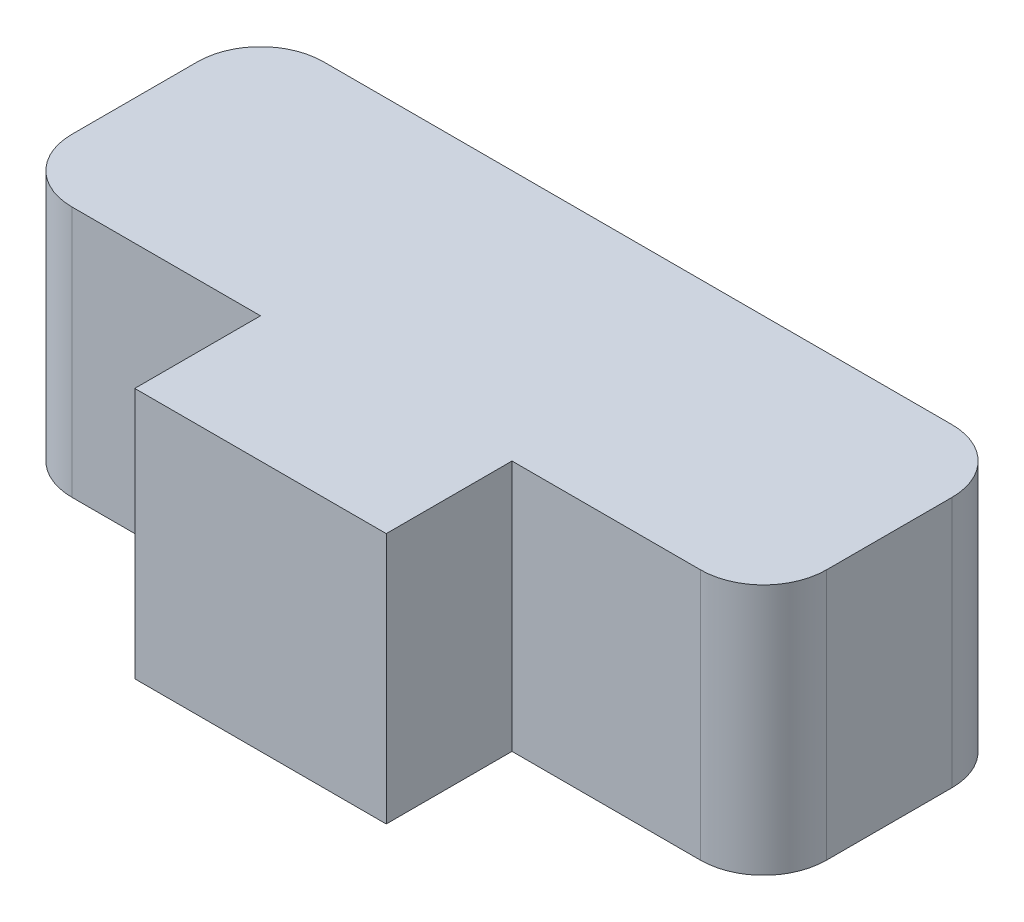
ISO-10303-21;
HEADER;
FILE_DESCRIPTION(('STEP AP214'),'2;1');
FILE_NAME('part.step','',(''),(''),'','','');
FILE_SCHEMA(('AUTOMOTIVE_DESIGN { 1 0 10303 214 1 1 1 1 }'));
ENDSEC;
DATA;
#1=APPLICATION_CONTEXT('core data for automotive mechanical design processes');
#2=APPLICATION_PROTOCOL_DEFINITION('international standard','automotive_design',2000,#1);
#3=PRODUCT_CONTEXT('',#1,'mechanical');
#4=PRODUCT('Part','Part','',(#3));
#5=PRODUCT_RELATED_PRODUCT_CATEGORY('part','',(#4));
#6=PRODUCT_DEFINITION_FORMATION('','',#4);
#7=PRODUCT_DEFINITION_CONTEXT('part definition',#1,'design');
#8=PRODUCT_DEFINITION('design','',#6,#7);
#9=PRODUCT_DEFINITION_SHAPE('','',#8);
#10=(LENGTH_UNIT() NAMED_UNIT(*) SI_UNIT(.MILLI.,.METRE.));
#11=(NAMED_UNIT(*) PLANE_ANGLE_UNIT() SI_UNIT($,.RADIAN.));
#12=(NAMED_UNIT(*) SI_UNIT($,.STERADIAN.) SOLID_ANGLE_UNIT());
#13=UNCERTAINTY_MEASURE_WITH_UNIT(LENGTH_MEASURE(1.E-05),#10,'distance_accuracy_value','');
#14=(GEOMETRIC_REPRESENTATION_CONTEXT(3) GLOBAL_UNCERTAINTY_ASSIGNED_CONTEXT((#13)) GLOBAL_UNIT_ASSIGNED_CONTEXT((#10,
#11,#12)) REPRESENTATION_CONTEXT('',''));
#15=CARTESIAN_POINT('',(0.,0.,0.));
#16=DIRECTION('',(0.,0.,1.));
#17=DIRECTION('',(1.,0.,0.));
#18=AXIS2_PLACEMENT_3D('',#15,#16,#17);
#19=CARTESIAN_POINT('',(-5.08,5.08,0.));
#20=DIRECTION('',(0.,0.,-1.));
#21=DIRECTION('',(-1.,0.,0.));
#22=AXIS2_PLACEMENT_3D('',#19,#20,#21);
#23=PLANE('',#22);
#24=DIRECTION('',(1.,0.,0.));
#25=VECTOR('',#24,1.);
#26=CARTESIAN_POINT('',(-5.08,5.08,0.));
#27=LINE('',#26,#25);
#28=CARTESIAN_POINT('',(-3.81,5.08,0.));
#29=VERTEX_POINT('',#28);
#30=CARTESIAN_POINT('',(0.,5.08,0.));
#31=VERTEX_POINT('',#30);
#32=EDGE_CURVE('E120',#29,#31,#27,.T.);
#33=ORIENTED_EDGE('',*,*,#32,.F.);
#34=DIRECTION('',(0.,-1.,0.));
#35=VECTOR('',#34,1.);
#36=CARTESIAN_POINT('',(-3.81,5.08,0.));
#37=LINE('',#36,#35);
#38=CARTESIAN_POINT('',(-3.81,0.,0.));
#39=VERTEX_POINT('',#38);
#40=EDGE_CURVE('E176',#29,#39,#37,.T.);
#41=ORIENTED_EDGE('',*,*,#40,.T.);
#42=DIRECTION('',(1.,0.,0.));
#43=VECTOR('',#42,1.);
#44=CARTESIAN_POINT('',(-5.08,0.,0.));
#45=LINE('',#44,#43);
#46=CARTESIAN_POINT('',(0.,0.,0.));
#47=VERTEX_POINT('',#46);
#48=EDGE_CURVE('E145',#39,#47,#45,.T.);
#49=ORIENTED_EDGE('',*,*,#48,.T.);
#50=DIRECTION('',(0.,-1.,0.));
#51=VECTOR('',#50,1.);
#52=CARTESIAN_POINT('',(0.,5.08,0.));
#53=LINE('',#52,#51);
#54=EDGE_CURVE('E138',#31,#47,#53,.T.);
#55=ORIENTED_EDGE('',*,*,#54,.F.);
#56=EDGE_LOOP('',(#33,#41,#49,#55));
#57=FACE_BOUND('',#56,.T.);
#58=ADVANCED_FACE('F33',(#57),#23,.F.);
#59=CARTESIAN_POINT('',(0.,5.08,0.));
#60=DIRECTION('',(1.,0.,0.));
#61=DIRECTION('',(0.,0.,-1.));
#62=AXIS2_PLACEMENT_3D('',#59,#60,#61);
#63=PLANE('',#62);
#64=DIRECTION('',(0.,0.,1.));
#65=VECTOR('',#64,1.);
#66=CARTESIAN_POINT('',(0.,0.,0.));
#67=LINE('',#66,#65);
#68=CARTESIAN_POINT('',(0.,0.,2.54));
#69=VERTEX_POINT('',#68);
#70=EDGE_CURVE('E217',#47,#69,#67,.T.);
#71=ORIENTED_EDGE('',*,*,#70,.T.);
#72=DIRECTION('',(0.,-1.,0.));
#73=VECTOR('',#72,1.);
#74=CARTESIAN_POINT('',(0.,5.08,2.54));
#75=LINE('',#74,#73);
#76=CARTESIAN_POINT('',(0.,5.08,2.54));
#77=VERTEX_POINT('',#76);
#78=EDGE_CURVE('E140',#77,#69,#75,.T.);
#79=ORIENTED_EDGE('',*,*,#78,.F.);
#80=DIRECTION('',(0.,0.,1.));
#81=VECTOR('',#80,1.);
#82=CARTESIAN_POINT('',(0.,5.08,0.));
#83=LINE('',#82,#81);
#84=EDGE_CURVE('E124',#31,#77,#83,.T.);
#85=ORIENTED_EDGE('',*,*,#84,.F.);
#86=ORIENTED_EDGE('',*,*,#54,.T.);
#87=EDGE_LOOP('',(#71,#79,#85,#86));
#88=FACE_BOUND('',#87,.T.);
#89=ADVANCED_FACE('F137',(#88),#63,.F.);
#90=CARTESIAN_POINT('',(0.,5.08,2.54));
#91=DIRECTION('',(0.,0.,-1.));
#92=DIRECTION('',(-1.,0.,0.));
#93=AXIS2_PLACEMENT_3D('',#90,#91,#92);
#94=PLANE('',#93);
#95=DIRECTION('',(1.,0.,0.));
#96=VECTOR('',#95,1.);
#97=CARTESIAN_POINT('',(0.,0.,2.54));
#98=LINE('',#97,#96);
#99=CARTESIAN_POINT('',(5.08,0.,2.54));
#100=VERTEX_POINT('',#99);
#101=EDGE_CURVE('E216',#69,#100,#98,.T.);
#102=ORIENTED_EDGE('',*,*,#101,.T.);
#103=DIRECTION('',(0.,-1.,0.));
#104=VECTOR('',#103,1.);
#105=CARTESIAN_POINT('',(5.08,5.08,2.54));
#106=LINE('',#105,#104);
#107=CARTESIAN_POINT('',(5.08,5.08,2.54));
#108=VERTEX_POINT('',#107);
#109=EDGE_CURVE('E151',#108,#100,#106,.T.);
#110=ORIENTED_EDGE('',*,*,#109,.F.);
#111=DIRECTION('',(1.,0.,0.));
#112=VECTOR('',#111,1.);
#113=CARTESIAN_POINT('',(0.,5.08,2.54));
#114=LINE('',#113,#112);
#115=EDGE_CURVE('E142',#77,#108,#114,.T.);
#116=ORIENTED_EDGE('',*,*,#115,.F.);
#117=ORIENTED_EDGE('',*,*,#78,.T.);
#118=EDGE_LOOP('',(#102,#110,#116,#117));
#119=FACE_BOUND('',#118,.T.);
#120=ADVANCED_FACE('F229',(#119),#94,.F.);
#121=CARTESIAN_POINT('',(5.08,5.08,0.));
#122=DIRECTION('',(-1.,0.,0.));
#123=DIRECTION('',(0.,0.,1.));
#124=AXIS2_PLACEMENT_3D('',#121,#122,#123);
#125=PLANE('',#124);
#126=DIRECTION('',(0.,0.,-1.));
#127=VECTOR('',#126,1.);
#128=CARTESIAN_POINT('',(5.08,0.,0.));
#129=LINE('',#128,#127);
#130=CARTESIAN_POINT('',(5.08,0.,0.));
#131=VERTEX_POINT('',#130);
#132=EDGE_CURVE('E197',#100,#131,#129,.T.);
#133=ORIENTED_EDGE('',*,*,#132,.T.);
#134=DIRECTION('',(0.,-1.,0.));
#135=VECTOR('',#134,1.);
#136=CARTESIAN_POINT('',(5.08,5.08,0.));
#137=LINE('',#136,#135);
#138=CARTESIAN_POINT('',(5.08,5.08,0.));
#139=VERTEX_POINT('',#138);
#140=EDGE_CURVE('E203',#139,#131,#137,.T.);
#141=ORIENTED_EDGE('',*,*,#140,.F.);
#142=DIRECTION('',(0.,0.,-1.));
#143=VECTOR('',#142,1.);
#144=CARTESIAN_POINT('',(5.08,5.08,0.));
#145=LINE('',#144,#143);
#146=EDGE_CURVE('E213',#108,#139,#145,.T.);
#147=ORIENTED_EDGE('',*,*,#146,.F.);
#148=ORIENTED_EDGE('',*,*,#109,.T.);
#149=EDGE_LOOP('',(#133,#141,#147,#148));
#150=FACE_BOUND('',#149,.T.);
#151=ADVANCED_FACE('F211',(#150),#125,.F.);
#152=CARTESIAN_POINT('',(5.08,5.08,0.));
#153=DIRECTION('',(0.,0.,-1.));
#154=DIRECTION('',(-1.,0.,0.));
#155=AXIS2_PLACEMENT_3D('',#152,#153,#154);
#156=PLANE('',#155);
#157=DIRECTION('',(1.,0.,0.));
#158=VECTOR('',#157,1.);
#159=CARTESIAN_POINT('',(5.08,0.,0.));
#160=LINE('',#159,#158);
#161=CARTESIAN_POINT('',(8.89,0.,0.));
#162=VERTEX_POINT('',#161);
#163=EDGE_CURVE('E193',#131,#162,#160,.T.);
#164=ORIENTED_EDGE('',*,*,#163,.T.);
#165=DIRECTION('',(0.,-1.,0.));
#166=VECTOR('',#165,1.);
#167=CARTESIAN_POINT('',(8.89,5.08,0.));
#168=LINE('',#167,#166);
#169=CARTESIAN_POINT('',(8.89,5.08,0.));
#170=VERTEX_POINT('',#169);
#171=EDGE_CURVE('E11',#162,#170,#168,.F.);
#172=ORIENTED_EDGE('',*,*,#171,.T.);
#173=DIRECTION('',(1.,0.,0.));
#174=VECTOR('',#173,1.);
#175=CARTESIAN_POINT('',(5.08,5.08,0.));
#176=LINE('',#175,#174);
#177=EDGE_CURVE('E226',#139,#170,#176,.T.);
#178=ORIENTED_EDGE('',*,*,#177,.F.);
#179=ORIENTED_EDGE('',*,*,#140,.T.);
#180=EDGE_LOOP('',(#164,#172,#178,#179));
#181=FACE_BOUND('',#180,.T.);
#182=ADVANCED_FACE('F236',(#181),#156,.F.);
#183=CARTESIAN_POINT('',(10.16,5.08,0.));
#184=DIRECTION('',(-1.,0.,0.));
#185=DIRECTION('',(0.,0.,1.));
#186=AXIS2_PLACEMENT_3D('',#183,#184,#185);
#187=PLANE('',#186);
#188=DIRECTION('',(0.,0.,-1.));
#189=VECTOR('',#188,1.);
#190=CARTESIAN_POINT('',(10.16,0.,0.));
#191=LINE('',#190,#189);
#192=CARTESIAN_POINT('',(10.16,0.,-1.27));
#193=VERTEX_POINT('',#192);
#194=CARTESIAN_POINT('',(10.16,0.,-3.81));
#195=VERTEX_POINT('',#194);
#196=EDGE_CURVE('E183',#193,#195,#191,.T.);
#197=ORIENTED_EDGE('',*,*,#196,.T.);
#198=DIRECTION('',(0.,-1.,0.));
#199=VECTOR('',#198,1.);
#200=CARTESIAN_POINT('',(10.16,5.08,-3.81));
#201=LINE('',#200,#199);
#202=CARTESIAN_POINT('',(10.16,5.08,-3.81));
#203=VERTEX_POINT('',#202);
#204=EDGE_CURVE('E41',#195,#203,#201,.F.);
#205=ORIENTED_EDGE('',*,*,#204,.T.);
#206=DIRECTION('',(0.,0.,-1.));
#207=VECTOR('',#206,1.);
#208=CARTESIAN_POINT('',(10.16,5.08,0.));
#209=LINE('',#208,#207);
#210=CARTESIAN_POINT('',(10.16,5.08,-1.27));
#211=VERTEX_POINT('',#210);
#212=EDGE_CURVE('E184',#211,#203,#209,.T.);
#213=ORIENTED_EDGE('',*,*,#212,.F.);
#214=DIRECTION('',(0.,-1.,0.));
#215=VECTOR('',#214,1.);
#216=CARTESIAN_POINT('',(10.16,5.08,-1.27));
#217=LINE('',#216,#215);
#218=EDGE_CURVE('E178',#211,#193,#217,.T.);
#219=ORIENTED_EDGE('',*,*,#218,.T.);
#220=EDGE_LOOP('',(#197,#205,#213,#219));
#221=FACE_BOUND('',#220,.T.);
#222=ADVANCED_FACE('F182',(#221),#187,.F.);
#223=CARTESIAN_POINT('',(10.16,5.08,-5.08));
#224=DIRECTION('',(0.,0.,1.));
#225=DIRECTION('',(1.,0.,0.));
#226=AXIS2_PLACEMENT_3D('',#223,#224,#225);
#227=PLANE('',#226);
#228=DIRECTION('',(-1.,0.,0.));
#229=VECTOR('',#228,1.);
#230=CARTESIAN_POINT('',(10.16,0.,-5.08));
#231=LINE('',#230,#229);
#232=CARTESIAN_POINT('',(8.89,0.,-5.08));
#233=VERTEX_POINT('',#232);
#234=CARTESIAN_POINT('',(-3.81,0.,-5.08));
#235=VERTEX_POINT('',#234);
#236=EDGE_CURVE('E192',#233,#235,#231,.T.);
#237=ORIENTED_EDGE('',*,*,#236,.T.);
#238=DIRECTION('',(0.,-1.,0.));
#239=VECTOR('',#238,1.);
#240=CARTESIAN_POINT('',(-3.81,5.08,-5.08));
#241=LINE('',#240,#239);
#242=CARTESIAN_POINT('',(-3.81,5.08,-5.08));
#243=VERTEX_POINT('',#242);
#244=EDGE_CURVE('E168',#235,#243,#241,.F.);
#245=ORIENTED_EDGE('',*,*,#244,.T.);
#246=DIRECTION('',(-1.,0.,0.));
#247=VECTOR('',#246,1.);
#248=CARTESIAN_POINT('',(10.16,5.08,-5.08));
#249=LINE('',#248,#247);
#250=CARTESIAN_POINT('',(8.89,5.08,-5.08));
#251=VERTEX_POINT('',#250);
#252=EDGE_CURVE('E223',#251,#243,#249,.T.);
#253=ORIENTED_EDGE('',*,*,#252,.F.);
#254=DIRECTION('',(0.,-1.,0.));
#255=VECTOR('',#254,1.);
#256=CARTESIAN_POINT('',(8.89,5.08,-5.08));
#257=LINE('',#256,#255);
#258=EDGE_CURVE('E165',#251,#233,#257,.T.);
#259=ORIENTED_EDGE('',*,*,#258,.T.);
#260=EDGE_LOOP('',(#237,#245,#253,#259));
#261=FACE_BOUND('',#260,.T.);
#262=ADVANCED_FACE('F262',(#261),#227,.F.);
#263=CARTESIAN_POINT('',(-5.08,5.08,-5.08));
#264=DIRECTION('',(1.,0.,0.));
#265=DIRECTION('',(0.,0.,-1.));
#266=AXIS2_PLACEMENT_3D('',#263,#264,#265);
#267=PLANE('',#266);
#268=DIRECTION('',(0.,0.,1.));
#269=VECTOR('',#268,1.);
#270=CARTESIAN_POINT('',(-5.08,5.08,-5.08));
#271=LINE('',#270,#269);
#272=CARTESIAN_POINT('',(-5.08,5.08,-3.81));
#273=VERTEX_POINT('',#272);
#274=CARTESIAN_POINT('',(-5.08,5.08,-1.27));
#275=VERTEX_POINT('',#274);
#276=EDGE_CURVE('E205',#273,#275,#271,.T.);
#277=ORIENTED_EDGE('',*,*,#276,.F.);
#278=DIRECTION('',(0.,-1.,0.));
#279=VECTOR('',#278,1.);
#280=CARTESIAN_POINT('',(-5.08,5.08,-3.81));
#281=LINE('',#280,#279);
#282=CARTESIAN_POINT('',(-5.08,0.,-3.81));
#283=VERTEX_POINT('',#282);
#284=EDGE_CURVE('E149',#273,#283,#281,.T.);
#285=ORIENTED_EDGE('',*,*,#284,.T.);
#286=DIRECTION('',(0.,0.,1.));
#287=VECTOR('',#286,1.);
#288=CARTESIAN_POINT('',(-5.08,0.,-5.08));
#289=LINE('',#288,#287);
#290=CARTESIAN_POINT('',(-5.08,0.,-1.27));
#291=VERTEX_POINT('',#290);
#292=EDGE_CURVE('E133',#283,#291,#289,.T.);
#293=ORIENTED_EDGE('',*,*,#292,.T.);
#294=DIRECTION('',(0.,-1.,0.));
#295=VECTOR('',#294,1.);
#296=CARTESIAN_POINT('',(-5.08,5.08,-1.27));
#297=LINE('',#296,#295);
#298=EDGE_CURVE('E147',#291,#275,#297,.F.);
#299=ORIENTED_EDGE('',*,*,#298,.T.);
#300=EDGE_LOOP('',(#277,#285,#293,#299));
#301=FACE_BOUND('',#300,.T.);
#302=ADVANCED_FACE('F267',(#301),#267,.F.);
#303=CARTESIAN_POINT('',(0.,5.08,0.));
#304=DIRECTION('',(0.,-1.,0.));
#305=DIRECTION('',(0.,0.,-1.));
#306=AXIS2_PLACEMENT_3D('',#303,#304,#305);
#307=PLANE('',#306);
#308=ORIENTED_EDGE('',*,*,#252,.T.);
#309=CARTESIAN_POINT('',(-3.81,5.08,-3.81));
#310=DIRECTION('',(0.,-1.,0.));
#311=DIRECTION('',(0.,0.,-1.));
#312=AXIS2_PLACEMENT_3D('',#309,#310,#311);
#313=CIRCLE('',#312,1.27);
#314=EDGE_CURVE('E174',#243,#273,#313,.F.);
#315=ORIENTED_EDGE('',*,*,#314,.T.);
#316=ORIENTED_EDGE('',*,*,#276,.T.);
#317=CARTESIAN_POINT('',(-3.81,5.08,-1.27));
#318=DIRECTION('',(0.,-1.,0.));
#319=DIRECTION('',(0.,0.,-1.));
#320=AXIS2_PLACEMENT_3D('',#317,#318,#319);
#321=CIRCLE('',#320,1.27);
#322=EDGE_CURVE('E128',#275,#29,#321,.F.);
#323=ORIENTED_EDGE('',*,*,#322,.T.);
#324=ORIENTED_EDGE('',*,*,#32,.T.);
#325=ORIENTED_EDGE('',*,*,#84,.T.);
#326=ORIENTED_EDGE('',*,*,#115,.T.);
#327=ORIENTED_EDGE('',*,*,#146,.T.);
#328=ORIENTED_EDGE('',*,*,#177,.T.);
#329=CARTESIAN_POINT('',(8.89,5.08,-1.27));
#330=DIRECTION('',(0.,-1.,0.));
#331=DIRECTION('',(0.,0.,-1.));
#332=AXIS2_PLACEMENT_3D('',#329,#330,#331);
#333=CIRCLE('',#332,1.27);
#334=EDGE_CURVE('E54',#170,#211,#333,.F.);
#335=ORIENTED_EDGE('',*,*,#334,.T.);
#336=ORIENTED_EDGE('',*,*,#212,.T.);
#337=CARTESIAN_POINT('',(8.89,5.08,-3.81));
#338=DIRECTION('',(0.,-1.,0.));
#339=DIRECTION('',(0.,0.,-1.));
#340=AXIS2_PLACEMENT_3D('',#337,#338,#339);
#341=CIRCLE('',#340,1.27);
#342=EDGE_CURVE('E171',#203,#251,#341,.F.);
#343=ORIENTED_EDGE('',*,*,#342,.T.);
#344=EDGE_LOOP('',(#308,#315,#316,#323,#324,#325,#326,#327,#328,#335,#336,#343));
#345=FACE_BOUND('',#344,.T.);
#346=ADVANCED_FACE('F123',(#345),#307,.F.);
#347=CARTESIAN_POINT('',(0.,0.,0.));
#348=DIRECTION('',(0.,-1.,0.));
#349=DIRECTION('',(0.,0.,-1.));
#350=AXIS2_PLACEMENT_3D('',#347,#348,#349);
#351=PLANE('',#350);
#352=ORIENTED_EDGE('',*,*,#292,.F.);
#353=CARTESIAN_POINT('',(-3.81,0.,-3.81));
#354=DIRECTION('',(0.,-1.,0.));
#355=DIRECTION('',(0.,0.,-1.));
#356=AXIS2_PLACEMENT_3D('',#353,#354,#355);
#357=CIRCLE('',#356,1.27);
#358=EDGE_CURVE('E163',#283,#235,#357,.T.);
#359=ORIENTED_EDGE('',*,*,#358,.T.);
#360=ORIENTED_EDGE('',*,*,#236,.F.);
#361=CARTESIAN_POINT('',(8.89,0.,-3.81));
#362=DIRECTION('',(0.,-1.,0.));
#363=DIRECTION('',(0.,0.,-1.));
#364=AXIS2_PLACEMENT_3D('',#361,#362,#363);
#365=CIRCLE('',#364,1.27);
#366=EDGE_CURVE('E159',#233,#195,#365,.T.);
#367=ORIENTED_EDGE('',*,*,#366,.T.);
#368=ORIENTED_EDGE('',*,*,#196,.F.);
#369=CARTESIAN_POINT('',(8.89,0.,-1.27));
#370=DIRECTION('',(0.,-1.,0.));
#371=DIRECTION('',(0.,0.,-1.));
#372=AXIS2_PLACEMENT_3D('',#369,#370,#371);
#373=CIRCLE('',#372,1.27);
#374=EDGE_CURVE('E157',#193,#162,#373,.T.);
#375=ORIENTED_EDGE('',*,*,#374,.T.);
#376=ORIENTED_EDGE('',*,*,#163,.F.);
#377=ORIENTED_EDGE('',*,*,#132,.F.);
#378=ORIENTED_EDGE('',*,*,#101,.F.);
#379=ORIENTED_EDGE('',*,*,#70,.F.);
#380=ORIENTED_EDGE('',*,*,#48,.F.);
#381=CARTESIAN_POINT('',(-3.81,0.,-1.27));
#382=DIRECTION('',(0.,-1.,0.));
#383=DIRECTION('',(0.,0.,-1.));
#384=AXIS2_PLACEMENT_3D('',#381,#382,#383);
#385=CIRCLE('',#384,1.27);
#386=EDGE_CURVE('E161',#39,#291,#385,.T.);
#387=ORIENTED_EDGE('',*,*,#386,.T.);
#388=EDGE_LOOP('',(#352,#359,#360,#367,#368,#375,#376,#377,#378,#379,#380,#387));
#389=FACE_BOUND('',#388,.T.);
#390=ADVANCED_FACE('F188',(#389),#351,.T.);
#391=CARTESIAN_POINT('',(-3.81,5.08,-3.81));
#392=DIRECTION('',(0.,-1.,0.));
#393=DIRECTION('',(0.,0.,-1.));
#394=AXIS2_PLACEMENT_3D('',#391,#392,#393);
#395=CYLINDRICAL_SURFACE('',#394,1.27);
#396=ORIENTED_EDGE('',*,*,#314,.F.);
#397=ORIENTED_EDGE('',*,*,#244,.F.);
#398=ORIENTED_EDGE('',*,*,#358,.F.);
#399=ORIENTED_EDGE('',*,*,#284,.F.);
#400=EDGE_LOOP('',(#396,#397,#398,#399));
#401=FACE_BOUND('',#400,.T.);
#402=ADVANCED_FACE('F244',(#401),#395,.T.);
#403=CARTESIAN_POINT('',(-3.81,5.08,-1.27));
#404=DIRECTION('',(0.,-1.,0.));
#405=DIRECTION('',(0.,0.,-1.));
#406=AXIS2_PLACEMENT_3D('',#403,#404,#405);
#407=CYLINDRICAL_SURFACE('',#406,1.27);
#408=ORIENTED_EDGE('',*,*,#322,.F.);
#409=ORIENTED_EDGE('',*,*,#298,.F.);
#410=ORIENTED_EDGE('',*,*,#386,.F.);
#411=ORIENTED_EDGE('',*,*,#40,.F.);
#412=EDGE_LOOP('',(#408,#409,#410,#411));
#413=FACE_BOUND('',#412,.T.);
#414=ADVANCED_FACE('F247',(#413),#407,.T.);
#415=CARTESIAN_POINT('',(8.89,5.08,-3.81));
#416=DIRECTION('',(0.,-1.,0.));
#417=DIRECTION('',(0.,0.,-1.));
#418=AXIS2_PLACEMENT_3D('',#415,#416,#417);
#419=CYLINDRICAL_SURFACE('',#418,1.27);
#420=ORIENTED_EDGE('',*,*,#342,.F.);
#421=ORIENTED_EDGE('',*,*,#204,.F.);
#422=ORIENTED_EDGE('',*,*,#366,.F.);
#423=ORIENTED_EDGE('',*,*,#258,.F.);
#424=EDGE_LOOP('',(#420,#421,#422,#423));
#425=FACE_BOUND('',#424,.T.);
#426=ADVANCED_FACE('F250',(#425),#419,.T.);
#427=CARTESIAN_POINT('',(8.89,5.08,-1.27));
#428=DIRECTION('',(0.,-1.,0.));
#429=DIRECTION('',(0.,0.,-1.));
#430=AXIS2_PLACEMENT_3D('',#427,#428,#429);
#431=CYLINDRICAL_SURFACE('',#430,1.27);
#432=ORIENTED_EDGE('',*,*,#334,.F.);
#433=ORIENTED_EDGE('',*,*,#171,.F.);
#434=ORIENTED_EDGE('',*,*,#374,.F.);
#435=ORIENTED_EDGE('',*,*,#218,.F.);
#436=EDGE_LOOP('',(#432,#433,#434,#435));
#437=FACE_BOUND('',#436,.T.);
#438=ADVANCED_FACE('F35',(#437),#431,.T.);
#439=CLOSED_SHELL('',(#58,#89,#120,#151,#182,#222,#262,#302,#346,#390,#402,#414,#426,#438));
#440=MANIFOLD_SOLID_BREP('B2',#439);
#441=ADVANCED_BREP_SHAPE_REPRESENTATION('',(#18,#440),#14);
#442=SHAPE_DEFINITION_REPRESENTATION(#9,#441);
ENDSEC;
END-ISO-10303-21;
